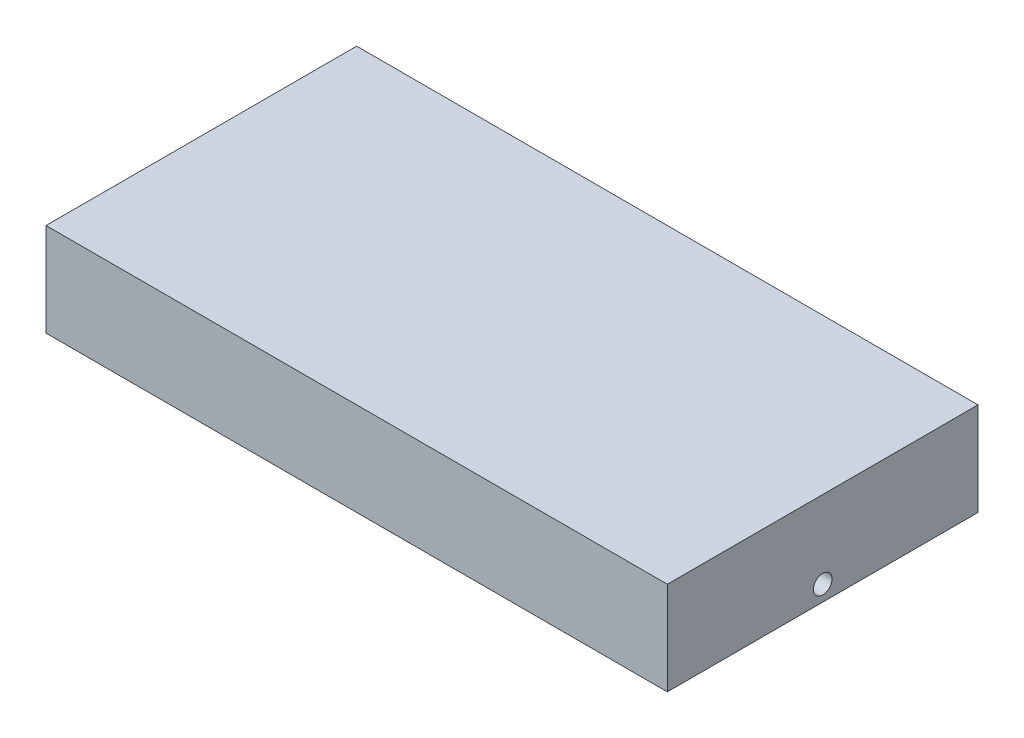
ISO-10303-21;
HEADER;
FILE_DESCRIPTION(('STEP AP214'),'2;1');
FILE_NAME('part.step','',(''),(''),'','','');
FILE_SCHEMA(('AUTOMOTIVE_DESIGN { 1 0 10303 214 1 1 1 1 }'));
ENDSEC;
DATA;
#1=APPLICATION_CONTEXT('core data for automotive mechanical design processes');
#2=APPLICATION_PROTOCOL_DEFINITION('international standard','automotive_design',2000,#1);
#3=PRODUCT_CONTEXT('',#1,'mechanical');
#4=PRODUCT('Part','Part','',(#3));
#5=PRODUCT_RELATED_PRODUCT_CATEGORY('part','',(#4));
#6=PRODUCT_DEFINITION_FORMATION('','',#4);
#7=PRODUCT_DEFINITION_CONTEXT('part definition',#1,'design');
#8=PRODUCT_DEFINITION('design','',#6,#7);
#9=PRODUCT_DEFINITION_SHAPE('','',#8);
#10=(LENGTH_UNIT() NAMED_UNIT(*) SI_UNIT(.MILLI.,.METRE.));
#11=(NAMED_UNIT(*) PLANE_ANGLE_UNIT() SI_UNIT($,.RADIAN.));
#12=(NAMED_UNIT(*) SI_UNIT($,.STERADIAN.) SOLID_ANGLE_UNIT());
#13=UNCERTAINTY_MEASURE_WITH_UNIT(LENGTH_MEASURE(1.E-05),#10,'distance_accuracy_value','');
#14=(GEOMETRIC_REPRESENTATION_CONTEXT(3) GLOBAL_UNCERTAINTY_ASSIGNED_CONTEXT((#13)) GLOBAL_UNIT_ASSIGNED_CONTEXT((#10,
#11,#12)) REPRESENTATION_CONTEXT('',''));
#15=CARTESIAN_POINT('',(0.,0.,0.));
#16=DIRECTION('',(0.,0.,1.));
#17=DIRECTION('',(1.,0.,0.));
#18=AXIS2_PLACEMENT_3D('',#15,#16,#17);
#19=CARTESIAN_POINT('',(-9.5,1.3,3.));
#20=DIRECTION('',(0.,-1.,0.));
#21=DIRECTION('',(0.,0.,-1.));
#22=AXIS2_PLACEMENT_3D('',#19,#20,#21);
#23=PLANE('',#22);
#24=DIRECTION('',(0.,0.,-1.));
#25=VECTOR('',#24,1.);
#26=CARTESIAN_POINT('',(-8.2,1.3,3.));
#27=LINE('',#26,#25);
#28=CARTESIAN_POINT('',(-8.2,1.3,3.));
#29=VERTEX_POINT('',#28);
#30=CARTESIAN_POINT('',(-8.2,1.3,-3.));
#31=VERTEX_POINT('',#30);
#32=EDGE_CURVE('E11',#29,#31,#27,.T.);
#33=ORIENTED_EDGE('',*,*,#32,.F.);
#34=DIRECTION('',(1.,0.,0.));
#35=VECTOR('',#34,1.);
#36=CARTESIAN_POINT('',(-9.5,1.3,3.));
#37=LINE('',#36,#35);
#38=CARTESIAN_POINT('',(-8.,1.3,3.));
#39=VERTEX_POINT('',#38);
#40=EDGE_CURVE('E234',#29,#39,#37,.T.);
#41=ORIENTED_EDGE('',*,*,#40,.T.);
#42=DIRECTION('',(0.,0.,-1.));
#43=VECTOR('',#42,1.);
#44=CARTESIAN_POINT('',(-8.,1.3,3.));
#45=LINE('',#44,#43);
#46=CARTESIAN_POINT('',(-8.,1.3,-3.));
#47=VERTEX_POINT('',#46);
#48=EDGE_CURVE('E224',#39,#47,#45,.T.);
#49=ORIENTED_EDGE('',*,*,#48,.T.);
#50=DIRECTION('',(1.,0.,0.));
#51=VECTOR('',#50,1.);
#52=CARTESIAN_POINT('',(-9.5,1.3,-3.));
#53=LINE('',#52,#51);
#54=EDGE_CURVE('E244',#31,#47,#53,.T.);
#55=ORIENTED_EDGE('',*,*,#54,.F.);
#56=EDGE_LOOP('',(#33,#41,#49,#55));
#57=FACE_BOUND('',#56,.T.);
#58=ADVANCED_FACE('F35',(#57),#23,.F.);
#59=CARTESIAN_POINT('',(-8.,2.,-3.));
#60=DIRECTION('',(1.,0.,0.));
#61=DIRECTION('',(0.,0.,-1.));
#62=AXIS2_PLACEMENT_3D('',#59,#60,#61);
#63=PLANE('',#62);
#64=DIRECTION('',(0.,0.,1.));
#65=VECTOR('',#64,1.);
#66=CARTESIAN_POINT('',(-8.,1.5,3.));
#67=LINE('',#66,#65);
#68=CARTESIAN_POINT('',(-8.,1.5,-3.));
#69=VERTEX_POINT('',#68);
#70=CARTESIAN_POINT('',(-8.,1.5,3.));
#71=VERTEX_POINT('',#70);
#72=EDGE_CURVE('E228',#69,#71,#67,.T.);
#73=ORIENTED_EDGE('',*,*,#72,.F.);
#74=DIRECTION('',(0.,-1.,0.));
#75=VECTOR('',#74,1.);
#76=CARTESIAN_POINT('',(-8.,2.,-3.));
#77=LINE('',#76,#75);
#78=CARTESIAN_POINT('',(-8.,2.,-3.));
#79=VERTEX_POINT('',#78);
#80=EDGE_CURVE('E268',#79,#69,#77,.T.);
#81=ORIENTED_EDGE('',*,*,#80,.F.);
#82=DIRECTION('',(0.,0.,1.));
#83=VECTOR('',#82,1.);
#84=CARTESIAN_POINT('',(-8.,2.,-3.));
#85=LINE('',#84,#83);
#86=CARTESIAN_POINT('',(-8.,2.,3.));
#87=VERTEX_POINT('',#86);
#88=EDGE_CURVE('E247',#79,#87,#85,.T.);
#89=ORIENTED_EDGE('',*,*,#88,.T.);
#90=DIRECTION('',(0.,-1.,0.));
#91=VECTOR('',#90,1.);
#92=CARTESIAN_POINT('',(-8.,2.,3.));
#93=LINE('',#92,#91);
#94=EDGE_CURVE('E276',#87,#71,#93,.T.);
#95=ORIENTED_EDGE('',*,*,#94,.T.);
#96=EDGE_LOOP('',(#73,#81,#89,#95));
#97=FACE_BOUND('',#96,.T.);
#98=ADVANCED_FACE('F339',(#97),#63,.T.);
#99=CARTESIAN_POINT('',(0.,0.,0.));
#100=DIRECTION('',(0.,1.,0.));
#101=DIRECTION('',(0.,0.,1.));
#102=AXIS2_PLACEMENT_3D('',#99,#100,#101);
#103=PLANE('',#102);
#104=DIRECTION('',(1.,0.,0.));
#105=VECTOR('',#104,1.);
#106=CARTESIAN_POINT('',(8.1,0.,-3.));
#107=LINE('',#106,#105);
#108=CARTESIAN_POINT('',(8.1,0.,-3.));
#109=VERTEX_POINT('',#108);
#110=CARTESIAN_POINT('',(9.5,0.,-3.));
#111=VERTEX_POINT('',#110);
#112=EDGE_CURVE('E194',#109,#111,#107,.T.);
#113=ORIENTED_EDGE('',*,*,#112,.F.);
#114=DIRECTION('',(0.,0.,-1.));
#115=VECTOR('',#114,1.);
#116=CARTESIAN_POINT('',(8.1,0.,3.));
#117=LINE('',#116,#115);
#118=CARTESIAN_POINT('',(8.1,0.,3.));
#119=VERTEX_POINT('',#118);
#120=EDGE_CURVE('E50',#119,#109,#117,.T.);
#121=ORIENTED_EDGE('',*,*,#120,.F.);
#122=DIRECTION('',(-1.,0.,0.));
#123=VECTOR('',#122,1.);
#124=CARTESIAN_POINT('',(8.1,0.,3.));
#125=LINE('',#124,#123);
#126=CARTESIAN_POINT('',(9.5,0.,3.));
#127=VERTEX_POINT('',#126);
#128=EDGE_CURVE('E182',#127,#119,#125,.T.);
#129=ORIENTED_EDGE('',*,*,#128,.F.);
#130=DIRECTION('',(0.,0.,1.));
#131=VECTOR('',#130,1.);
#132=CARTESIAN_POINT('',(9.5,0.,3.));
#133=LINE('',#132,#131);
#134=EDGE_CURVE('E185',#111,#127,#133,.T.);
#135=ORIENTED_EDGE('',*,*,#134,.F.);
#136=EDGE_LOOP('',(#113,#121,#129,#135));
#137=FACE_BOUND('',#136,.T.);
#138=DIRECTION('',(0.,0.,1.));
#139=VECTOR('',#138,1.);
#140=CARTESIAN_POINT('',(-9.99999999999999,0.,-5.));
#141=LINE('',#140,#139);
#142=CARTESIAN_POINT('',(-9.99999999999999,0.,-5.));
#143=VERTEX_POINT('',#142);
#144=CARTESIAN_POINT('',(-9.99999999999998,0.,5.));
#145=VERTEX_POINT('',#144);
#146=EDGE_CURVE('E279',#143,#145,#141,.T.);
#147=ORIENTED_EDGE('',*,*,#146,.F.);
#148=DIRECTION('',(-1.,0.,0.));
#149=VECTOR('',#148,1.);
#150=CARTESIAN_POINT('',(-9.99999999999999,0.,-5.));
#151=LINE('',#150,#149);
#152=CARTESIAN_POINT('',(9.99999999999999,0.,-5.));
#153=VERTEX_POINT('',#152);
#154=EDGE_CURVE('E284',#153,#143,#151,.T.);
#155=ORIENTED_EDGE('',*,*,#154,.F.);
#156=DIRECTION('',(0.,0.,-1.));
#157=VECTOR('',#156,1.);
#158=CARTESIAN_POINT('',(9.99999999999999,0.,-5.));
#159=LINE('',#158,#157);
#160=CARTESIAN_POINT('',(9.99999999999999,0.,5.));
#161=VERTEX_POINT('',#160);
#162=EDGE_CURVE('E295',#161,#153,#159,.T.);
#163=ORIENTED_EDGE('',*,*,#162,.F.);
#164=DIRECTION('',(1.,0.,0.));
#165=VECTOR('',#164,1.);
#166=CARTESIAN_POINT('',(-9.99999999999998,0.,5.));
#167=LINE('',#166,#165);
#168=EDGE_CURVE('E293',#145,#161,#167,.T.);
#169=ORIENTED_EDGE('',*,*,#168,.F.);
#170=EDGE_LOOP('',(#147,#155,#163,#169));
#171=FACE_BOUND('',#170,.T.);
#172=DIRECTION('',(0.,0.,1.));
#173=VECTOR('',#172,1.);
#174=CARTESIAN_POINT('',(-8.,0.,-3.));
#175=LINE('',#174,#173);
#176=CARTESIAN_POINT('',(-8.,0.,-3.));
#177=VERTEX_POINT('',#176);
#178=CARTESIAN_POINT('',(-8.,0.,3.));
#179=VERTEX_POINT('',#178);
#180=EDGE_CURVE('E241',#177,#179,#175,.T.);
#181=ORIENTED_EDGE('',*,*,#180,.T.);
#182=DIRECTION('',(1.,0.,0.));
#183=VECTOR('',#182,1.);
#184=CARTESIAN_POINT('',(-8.,0.,3.));
#185=LINE('',#184,#183);
#186=CARTESIAN_POINT('',(8.,0.,3.));
#187=VERTEX_POINT('',#186);
#188=EDGE_CURVE('E260',#179,#187,#185,.T.);
#189=ORIENTED_EDGE('',*,*,#188,.T.);
#190=DIRECTION('',(0.,0.,-1.));
#191=VECTOR('',#190,1.);
#192=CARTESIAN_POINT('',(8.,0.,-3.));
#193=LINE('',#192,#191);
#194=CARTESIAN_POINT('',(8.,0.,-3.));
#195=VERTEX_POINT('',#194);
#196=EDGE_CURVE('E263',#187,#195,#193,.T.);
#197=ORIENTED_EDGE('',*,*,#196,.T.);
#198=DIRECTION('',(-1.,0.,0.));
#199=VECTOR('',#198,1.);
#200=CARTESIAN_POINT('',(-8.,0.,-3.));
#201=LINE('',#200,#199);
#202=EDGE_CURVE('E251',#195,#177,#201,.T.);
#203=ORIENTED_EDGE('',*,*,#202,.T.);
#204=EDGE_LOOP('',(#181,#189,#197,#203));
#205=FACE_BOUND('',#204,.T.);
#206=ADVANCED_FACE('F316',(#137,#171,#205),#103,.F.);
#207=CARTESIAN_POINT('',(-9.99999999999999,3.,-5.));
#208=DIRECTION('',(1.,0.,0.));
#209=DIRECTION('',(0.,0.,-1.));
#210=AXIS2_PLACEMENT_3D('',#207,#208,#209);
#211=PLANE('',#210);
#212=CARTESIAN_POINT('',(-9.99999999999999,0.5,0.));
#213=DIRECTION('',(-1.,0.,0.));
#214=DIRECTION('',(0.,0.,1.));
#215=AXIS2_PLACEMENT_3D('',#212,#213,#214);
#216=CIRCLE('',#215,0.3);
#217=CARTESIAN_POINT('',(-9.99999999999999,0.5,0.300000000000014));
#218=VERTEX_POINT('',#217);
#219=EDGE_CURVE('E201',#218,#218,#216,.T.);
#220=ORIENTED_EDGE('',*,*,#219,.F.);
#221=EDGE_LOOP('',(#220));
#222=FACE_BOUND('',#221,.T.);
#223=ORIENTED_EDGE('',*,*,#146,.T.);
#224=DIRECTION('',(0.,-1.,0.));
#225=VECTOR('',#224,1.);
#226=CARTESIAN_POINT('',(-9.99999999999998,3.,5.));
#227=LINE('',#226,#225);
#228=CARTESIAN_POINT('',(-9.99999999999998,3.,5.));
#229=VERTEX_POINT('',#228);
#230=EDGE_CURVE('E43',#229,#145,#227,.T.);
#231=ORIENTED_EDGE('',*,*,#230,.F.);
#232=DIRECTION('',(0.,0.,1.));
#233=VECTOR('',#232,1.);
#234=CARTESIAN_POINT('',(-9.99999999999999,3.,-5.));
#235=LINE('',#234,#233);
#236=CARTESIAN_POINT('',(-9.99999999999999,3.,-5.));
#237=VERTEX_POINT('',#236);
#238=EDGE_CURVE('E280',#237,#229,#235,.T.);
#239=ORIENTED_EDGE('',*,*,#238,.F.);
#240=DIRECTION('',(0.,-1.,0.));
#241=VECTOR('',#240,1.);
#242=CARTESIAN_POINT('',(-9.99999999999999,3.,-5.));
#243=LINE('',#242,#241);
#244=EDGE_CURVE('E290',#237,#143,#243,.T.);
#245=ORIENTED_EDGE('',*,*,#244,.T.);
#246=EDGE_LOOP('',(#223,#231,#239,#245));
#247=FACE_BOUND('',#246,.T.);
#248=ADVANCED_FACE('F37',(#222,#247),#211,.F.);
#249=CARTESIAN_POINT('',(-9.99999999999998,3.,5.));
#250=DIRECTION('',(0.,0.,-1.));
#251=DIRECTION('',(-1.,0.,0.));
#252=AXIS2_PLACEMENT_3D('',#249,#250,#251);
#253=PLANE('',#252);
#254=ORIENTED_EDGE('',*,*,#168,.T.);
#255=DIRECTION('',(0.,-1.,0.));
#256=VECTOR('',#255,1.);
#257=CARTESIAN_POINT('',(9.99999999999999,3.,5.));
#258=LINE('',#257,#256);
#259=CARTESIAN_POINT('',(9.99999999999999,3.,5.));
#260=VERTEX_POINT('',#259);
#261=EDGE_CURVE('E303',#260,#161,#258,.T.);
#262=ORIENTED_EDGE('',*,*,#261,.F.);
#263=DIRECTION('',(1.,0.,0.));
#264=VECTOR('',#263,1.);
#265=CARTESIAN_POINT('',(-9.99999999999998,3.,5.));
#266=LINE('',#265,#264);
#267=EDGE_CURVE('E283',#229,#260,#266,.T.);
#268=ORIENTED_EDGE('',*,*,#267,.F.);
#269=ORIENTED_EDGE('',*,*,#230,.T.);
#270=EDGE_LOOP('',(#254,#262,#268,#269));
#271=FACE_BOUND('',#270,.T.);
#272=ADVANCED_FACE('F308',(#271),#253,.F.);
#273=CARTESIAN_POINT('',(9.99999999999999,3.,-5.));
#274=DIRECTION('',(-1.,0.,0.));
#275=DIRECTION('',(0.,0.,1.));
#276=AXIS2_PLACEMENT_3D('',#273,#274,#275);
#277=PLANE('',#276);
#278=CARTESIAN_POINT('',(9.99999999999999,0.5,0.));
#279=DIRECTION('',(1.,0.,0.));
#280=DIRECTION('',(0.,0.,-1.));
#281=AXIS2_PLACEMENT_3D('',#278,#279,#280);
#282=CIRCLE('',#281,0.3);
#283=CARTESIAN_POINT('',(9.99999999999999,0.5,-0.299999999999986));
#284=VERTEX_POINT('',#283);
#285=EDGE_CURVE('E188',#284,#284,#282,.T.);
#286=ORIENTED_EDGE('',*,*,#285,.F.);
#287=EDGE_LOOP('',(#286));
#288=FACE_BOUND('',#287,.T.);
#289=ORIENTED_EDGE('',*,*,#162,.T.);
#290=DIRECTION('',(0.,-1.,0.));
#291=VECTOR('',#290,1.);
#292=CARTESIAN_POINT('',(9.99999999999999,3.,-5.));
#293=LINE('',#292,#291);
#294=CARTESIAN_POINT('',(9.99999999999999,3.,-5.));
#295=VERTEX_POINT('',#294);
#296=EDGE_CURVE('E300',#295,#153,#293,.T.);
#297=ORIENTED_EDGE('',*,*,#296,.F.);
#298=DIRECTION('',(0.,0.,-1.));
#299=VECTOR('',#298,1.);
#300=CARTESIAN_POINT('',(9.99999999999999,3.,-5.));
#301=LINE('',#300,#299);
#302=EDGE_CURVE('E286',#260,#295,#301,.T.);
#303=ORIENTED_EDGE('',*,*,#302,.F.);
#304=ORIENTED_EDGE('',*,*,#261,.T.);
#305=EDGE_LOOP('',(#289,#297,#303,#304));
#306=FACE_BOUND('',#305,.T.);
#307=ADVANCED_FACE('F321',(#288,#306),#277,.F.);
#308=CARTESIAN_POINT('',(-9.99999999999999,3.,-5.));
#309=DIRECTION('',(0.,0.,1.));
#310=DIRECTION('',(1.,0.,0.));
#311=AXIS2_PLACEMENT_3D('',#308,#309,#310);
#312=PLANE('',#311);
#313=ORIENTED_EDGE('',*,*,#154,.T.);
#314=ORIENTED_EDGE('',*,*,#244,.F.);
#315=DIRECTION('',(-1.,0.,0.));
#316=VECTOR('',#315,1.);
#317=CARTESIAN_POINT('',(-9.99999999999999,3.,-5.));
#318=LINE('',#317,#316);
#319=EDGE_CURVE('E288',#295,#237,#318,.T.);
#320=ORIENTED_EDGE('',*,*,#319,.F.);
#321=ORIENTED_EDGE('',*,*,#296,.T.);
#322=EDGE_LOOP('',(#313,#314,#320,#321));
#323=FACE_BOUND('',#322,.T.);
#324=ADVANCED_FACE('F325',(#323),#312,.F.);
#325=CARTESIAN_POINT('',(0.,3.,0.));
#326=DIRECTION('',(0.,1.,0.));
#327=DIRECTION('',(0.,0.,1.));
#328=AXIS2_PLACEMENT_3D('',#325,#326,#327);
#329=PLANE('',#328);
#330=ORIENTED_EDGE('',*,*,#238,.T.);
#331=ORIENTED_EDGE('',*,*,#267,.T.);
#332=ORIENTED_EDGE('',*,*,#302,.T.);
#333=ORIENTED_EDGE('',*,*,#319,.T.);
#334=EDGE_LOOP('',(#330,#331,#332,#333));
#335=FACE_BOUND('',#334,.T.);
#336=ADVANCED_FACE('F327',(#335),#329,.T.);
#337=ORIENTED_EDGE('',*,*,#48,.F.);
#338=EDGE_CURVE('E275',#39,#179,#93,.T.);
#339=ORIENTED_EDGE('',*,*,#338,.T.);
#340=ORIENTED_EDGE('',*,*,#180,.F.);
#341=EDGE_CURVE('E257',#47,#177,#77,.T.);
#342=ORIENTED_EDGE('',*,*,#341,.F.);
#343=EDGE_LOOP('',(#337,#339,#340,#342));
#344=FACE_BOUND('',#343,.T.);
#345=ADVANCED_FACE('F329',(#344),#63,.T.);
#346=CARTESIAN_POINT('',(-8.,2.,3.));
#347=DIRECTION('',(0.,0.,-1.));
#348=DIRECTION('',(-1.,0.,0.));
#349=AXIS2_PLACEMENT_3D('',#346,#347,#348);
#350=PLANE('',#349);
#351=DIRECTION('',(1.,0.,0.));
#352=VECTOR('',#351,1.);
#353=CARTESIAN_POINT('',(-9.5,1.5,3.));
#354=LINE('',#353,#352);
#355=CARTESIAN_POINT('',(-9.5,1.5,3.));
#356=VERTEX_POINT('',#355);
#357=EDGE_CURVE('E239',#356,#71,#354,.T.);
#358=ORIENTED_EDGE('',*,*,#357,.T.);
#359=ORIENTED_EDGE('',*,*,#94,.F.);
#360=DIRECTION('',(1.,0.,0.));
#361=VECTOR('',#360,1.);
#362=CARTESIAN_POINT('',(-8.,2.,3.));
#363=LINE('',#362,#361);
#364=CARTESIAN_POINT('',(8.,2.,3.));
#365=VERTEX_POINT('',#364);
#366=EDGE_CURVE('E250',#87,#365,#363,.T.);
#367=ORIENTED_EDGE('',*,*,#366,.T.);
#368=DIRECTION('',(0.,-1.,0.));
#369=VECTOR('',#368,1.);
#370=CARTESIAN_POINT('',(8.,2.,3.));
#371=LINE('',#370,#369);
#372=EDGE_CURVE('E273',#365,#187,#371,.T.);
#373=ORIENTED_EDGE('',*,*,#372,.T.);
#374=ORIENTED_EDGE('',*,*,#188,.F.);
#375=ORIENTED_EDGE('',*,*,#338,.F.);
#376=ORIENTED_EDGE('',*,*,#40,.F.);
#377=DIRECTION('',(0.,1.,0.));
#378=VECTOR('',#377,1.);
#379=CARTESIAN_POINT('',(-8.2,0.2,3.));
#380=LINE('',#379,#378);
#381=CARTESIAN_POINT('',(-8.2,0.2,3.));
#382=VERTEX_POINT('',#381);
#383=EDGE_CURVE('E222',#382,#29,#380,.T.);
#384=ORIENTED_EDGE('',*,*,#383,.F.);
#385=DIRECTION('',(-1.,0.,0.));
#386=VECTOR('',#385,1.);
#387=CARTESIAN_POINT('',(-8.2,0.2,3.));
#388=LINE('',#387,#386);
#389=CARTESIAN_POINT('',(-9.5,0.2,3.));
#390=VERTEX_POINT('',#389);
#391=EDGE_CURVE('E211',#382,#390,#388,.T.);
#392=ORIENTED_EDGE('',*,*,#391,.T.);
#393=DIRECTION('',(0.,-1.,0.));
#394=VECTOR('',#393,1.);
#395=CARTESIAN_POINT('',(-9.5,1.3,3.));
#396=LINE('',#395,#394);
#397=EDGE_CURVE('E225',#356,#390,#396,.T.);
#398=ORIENTED_EDGE('',*,*,#397,.F.);
#399=EDGE_LOOP('',(#358,#359,#367,#373,#374,#375,#376,#384,#392,#398));
#400=FACE_BOUND('',#399,.T.);
#401=ADVANCED_FACE('F336',(#400),#350,.T.);
#402=CARTESIAN_POINT('',(8.,2.,-3.));
#403=DIRECTION('',(-1.,0.,0.));
#404=DIRECTION('',(0.,0.,1.));
#405=AXIS2_PLACEMENT_3D('',#402,#403,#404);
#406=PLANE('',#405);
#407=ORIENTED_EDGE('',*,*,#196,.F.);
#408=ORIENTED_EDGE('',*,*,#372,.F.);
#409=DIRECTION('',(0.,0.,-1.));
#410=VECTOR('',#409,1.);
#411=CARTESIAN_POINT('',(8.,2.,-3.));
#412=LINE('',#411,#410);
#413=CARTESIAN_POINT('',(8.,2.,-3.));
#414=VERTEX_POINT('',#413);
#415=EDGE_CURVE('E253',#365,#414,#412,.T.);
#416=ORIENTED_EDGE('',*,*,#415,.T.);
#417=DIRECTION('',(0.,-1.,0.));
#418=VECTOR('',#417,1.);
#419=CARTESIAN_POINT('',(8.,2.,-3.));
#420=LINE('',#419,#418);
#421=EDGE_CURVE('E271',#414,#195,#420,.T.);
#422=ORIENTED_EDGE('',*,*,#421,.T.);
#423=EDGE_LOOP('',(#407,#408,#416,#422));
#424=FACE_BOUND('',#423,.T.);
#425=ADVANCED_FACE('F363',(#424),#406,.T.);
#426=CARTESIAN_POINT('',(-8.,2.,-3.));
#427=DIRECTION('',(0.,0.,1.));
#428=DIRECTION('',(1.,0.,0.));
#429=AXIS2_PLACEMENT_3D('',#426,#427,#428);
#430=PLANE('',#429);
#431=DIRECTION('',(0.,1.,0.));
#432=VECTOR('',#431,1.);
#433=CARTESIAN_POINT('',(-8.2,0.2,-3.));
#434=LINE('',#433,#432);
#435=CARTESIAN_POINT('',(-8.2,0.2,-3.));
#436=VERTEX_POINT('',#435);
#437=EDGE_CURVE('E220',#436,#31,#434,.T.);
#438=ORIENTED_EDGE('',*,*,#437,.T.);
#439=ORIENTED_EDGE('',*,*,#54,.T.);
#440=ORIENTED_EDGE('',*,*,#341,.T.);
#441=ORIENTED_EDGE('',*,*,#202,.F.);
#442=ORIENTED_EDGE('',*,*,#421,.F.);
#443=DIRECTION('',(-1.,0.,0.));
#444=VECTOR('',#443,1.);
#445=CARTESIAN_POINT('',(-8.,2.,-3.));
#446=LINE('',#445,#444);
#447=EDGE_CURVE('E255',#414,#79,#446,.T.);
#448=ORIENTED_EDGE('',*,*,#447,.T.);
#449=ORIENTED_EDGE('',*,*,#80,.T.);
#450=DIRECTION('',(1.,0.,0.));
#451=VECTOR('',#450,1.);
#452=CARTESIAN_POINT('',(-9.5,1.5,-3.));
#453=LINE('',#452,#451);
#454=CARTESIAN_POINT('',(-9.5,1.5,-3.));
#455=VERTEX_POINT('',#454);
#456=EDGE_CURVE('E242',#455,#69,#453,.T.);
#457=ORIENTED_EDGE('',*,*,#456,.F.);
#458=DIRECTION('',(0.,1.,0.));
#459=VECTOR('',#458,1.);
#460=CARTESIAN_POINT('',(-9.5,1.3,-3.));
#461=LINE('',#460,#459);
#462=CARTESIAN_POINT('',(-9.5,0.2,-3.));
#463=VERTEX_POINT('',#462);
#464=EDGE_CURVE('E227',#463,#455,#461,.T.);
#465=ORIENTED_EDGE('',*,*,#464,.F.);
#466=DIRECTION('',(1.,0.,0.));
#467=VECTOR('',#466,1.);
#468=CARTESIAN_POINT('',(-8.2,0.2,-3.));
#469=LINE('',#468,#467);
#470=EDGE_CURVE('E218',#463,#436,#469,.T.);
#471=ORIENTED_EDGE('',*,*,#470,.T.);
#472=EDGE_LOOP('',(#438,#439,#440,#441,#442,#448,#449,#457,#465,#471));
#473=FACE_BOUND('',#472,.T.);
#474=ADVANCED_FACE('F359',(#473),#430,.T.);
#475=CARTESIAN_POINT('',(0.,2.,0.));
#476=DIRECTION('',(0.,1.,0.));
#477=DIRECTION('',(0.,0.,1.));
#478=AXIS2_PLACEMENT_3D('',#475,#476,#477);
#479=PLANE('',#478);
#480=ORIENTED_EDGE('',*,*,#88,.F.);
#481=ORIENTED_EDGE('',*,*,#447,.F.);
#482=ORIENTED_EDGE('',*,*,#415,.F.);
#483=ORIENTED_EDGE('',*,*,#366,.F.);
#484=EDGE_LOOP('',(#480,#481,#482,#483));
#485=FACE_BOUND('',#484,.T.);
#486=ADVANCED_FACE('F356',(#485),#479,.F.);
#487=CARTESIAN_POINT('',(-9.5,1.5,3.));
#488=DIRECTION('',(0.,1.,0.));
#489=DIRECTION('',(0.,0.,1.));
#490=AXIS2_PLACEMENT_3D('',#487,#488,#489);
#491=PLANE('',#490);
#492=ORIENTED_EDGE('',*,*,#456,.T.);
#493=ORIENTED_EDGE('',*,*,#72,.T.);
#494=ORIENTED_EDGE('',*,*,#357,.F.);
#495=DIRECTION('',(0.,0.,1.));
#496=VECTOR('',#495,1.);
#497=CARTESIAN_POINT('',(-9.5,1.5,3.));
#498=LINE('',#497,#496);
#499=EDGE_CURVE('E231',#455,#356,#498,.T.);
#500=ORIENTED_EDGE('',*,*,#499,.F.);
#501=EDGE_LOOP('',(#492,#493,#494,#500));
#502=FACE_BOUND('',#501,.T.);
#503=ADVANCED_FACE('F354',(#502),#491,.F.);
#504=CARTESIAN_POINT('',(-9.5,0.,0.));
#505=DIRECTION('',(-1.,0.,0.));
#506=DIRECTION('',(0.,0.,1.));
#507=AXIS2_PLACEMENT_3D('',#504,#505,#506);
#508=PLANE('',#507);
#509=DIRECTION('',(0.,0.,-1.));
#510=VECTOR('',#509,1.);
#511=CARTESIAN_POINT('',(-9.5,0.2,3.));
#512=LINE('',#511,#510);
#513=CARTESIAN_POINT('',(-9.49999999999999,0.2,0.));
#514=VERTEX_POINT('',#513);
#515=EDGE_CURVE('E215',#390,#514,#512,.T.);
#516=ORIENTED_EDGE('',*,*,#515,.T.);
#517=CARTESIAN_POINT('',(-9.49999999999999,0.5,0.));
#518=DIRECTION('',(-1.,0.,0.));
#519=DIRECTION('',(0.,0.,1.));
#520=AXIS2_PLACEMENT_3D('',#517,#518,#519);
#521=CIRCLE('',#520,0.3);
#522=EDGE_CURVE('E56',#514,#514,#521,.T.);
#523=ORIENTED_EDGE('',*,*,#522,.T.);
#524=EDGE_CURVE('E214',#514,#463,#512,.T.);
#525=ORIENTED_EDGE('',*,*,#524,.T.);
#526=ORIENTED_EDGE('',*,*,#464,.T.);
#527=ORIENTED_EDGE('',*,*,#499,.T.);
#528=ORIENTED_EDGE('',*,*,#397,.T.);
#529=EDGE_LOOP('',(#516,#523,#525,#526,#527,#528));
#530=FACE_BOUND('',#529,.T.);
#531=ADVANCED_FACE('F402',(#530),#508,.F.);
#532=CARTESIAN_POINT('',(-8.2,0.2,3.));
#533=DIRECTION('',(-1.,0.,0.));
#534=DIRECTION('',(0.,0.,1.));
#535=AXIS2_PLACEMENT_3D('',#532,#533,#534);
#536=PLANE('',#535);
#537=ORIENTED_EDGE('',*,*,#32,.T.);
#538=ORIENTED_EDGE('',*,*,#437,.F.);
#539=DIRECTION('',(0.,0.,1.));
#540=VECTOR('',#539,1.);
#541=CARTESIAN_POINT('',(-8.2,0.2,3.));
#542=LINE('',#541,#540);
#543=EDGE_CURVE('E206',#436,#382,#542,.T.);
#544=ORIENTED_EDGE('',*,*,#543,.T.);
#545=ORIENTED_EDGE('',*,*,#383,.T.);
#546=EDGE_LOOP('',(#537,#538,#544,#545));
#547=FACE_BOUND('',#546,.T.);
#548=ADVANCED_FACE('F394',(#547),#536,.T.);
#549=CARTESIAN_POINT('',(0.,0.2,0.));
#550=DIRECTION('',(0.,1.,0.));
#551=DIRECTION('',(0.,0.,1.));
#552=AXIS2_PLACEMENT_3D('',#549,#550,#551);
#553=PLANE('',#552);
#554=ORIENTED_EDGE('',*,*,#543,.F.);
#555=ORIENTED_EDGE('',*,*,#470,.F.);
#556=ORIENTED_EDGE('',*,*,#524,.F.);
#557=ORIENTED_EDGE('',*,*,#515,.F.);
#558=ORIENTED_EDGE('',*,*,#391,.F.);
#559=EDGE_LOOP('',(#554,#555,#556,#557,#558));
#560=FACE_BOUND('',#559,.T.);
#561=ADVANCED_FACE('F399',(#560),#553,.T.);
#562=CARTESIAN_POINT('',(-9.49999999999999,0.5,0.));
#563=DIRECTION('',(-1.,0.,0.));
#564=DIRECTION('',(0.,0.,1.));
#565=AXIS2_PLACEMENT_3D('',#562,#563,#564);
#566=CYLINDRICAL_SURFACE('',#565,0.3);
#567=ORIENTED_EDGE('',*,*,#522,.F.);
#568=EDGE_LOOP('',(#567));
#569=FACE_BOUND('',#568,.T.);
#570=ORIENTED_EDGE('',*,*,#219,.T.);
#571=EDGE_LOOP('',(#570));
#572=FACE_BOUND('',#571,.T.);
#573=ADVANCED_FACE('F413',(#569,#572),#566,.F.);
#574=CARTESIAN_POINT('',(8.1,1.5,3.));
#575=DIRECTION('',(-1.,0.,0.));
#576=DIRECTION('',(0.,0.,1.));
#577=AXIS2_PLACEMENT_3D('',#574,#575,#576);
#578=PLANE('',#577);
#579=ORIENTED_EDGE('',*,*,#120,.T.);
#580=DIRECTION('',(0.,-1.,0.));
#581=VECTOR('',#580,1.);
#582=CARTESIAN_POINT('',(8.1,1.5,-3.));
#583=LINE('',#582,#581);
#584=CARTESIAN_POINT('',(8.1,1.5,-3.));
#585=VERTEX_POINT('',#584);
#586=EDGE_CURVE('E160',#585,#109,#583,.T.);
#587=ORIENTED_EDGE('',*,*,#586,.F.);
#588=DIRECTION('',(0.,0.,-1.));
#589=VECTOR('',#588,1.);
#590=CARTESIAN_POINT('',(8.1,1.5,3.));
#591=LINE('',#590,#589);
#592=CARTESIAN_POINT('',(8.1,1.5,3.));
#593=VERTEX_POINT('',#592);
#594=EDGE_CURVE('E164',#593,#585,#591,.T.);
#595=ORIENTED_EDGE('',*,*,#594,.F.);
#596=DIRECTION('',(0.,-1.,0.));
#597=VECTOR('',#596,1.);
#598=CARTESIAN_POINT('',(8.1,1.5,3.));
#599=LINE('',#598,#597);
#600=EDGE_CURVE('E199',#593,#119,#599,.T.);
#601=ORIENTED_EDGE('',*,*,#600,.T.);
#602=EDGE_LOOP('',(#579,#587,#595,#601));
#603=FACE_BOUND('',#602,.T.);
#604=ADVANCED_FACE('F162',(#603),#578,.F.);
#605=CARTESIAN_POINT('',(8.1,1.5,3.));
#606=DIRECTION('',(0.,0.,1.));
#607=DIRECTION('',(1.,0.,0.));
#608=AXIS2_PLACEMENT_3D('',#605,#606,#607);
#609=PLANE('',#608);
#610=ORIENTED_EDGE('',*,*,#128,.T.);
#611=ORIENTED_EDGE('',*,*,#600,.F.);
#612=DIRECTION('',(-1.,0.,0.));
#613=VECTOR('',#612,1.);
#614=CARTESIAN_POINT('',(8.1,1.5,3.));
#615=LINE('',#614,#613);
#616=CARTESIAN_POINT('',(9.5,1.5,3.));
#617=VERTEX_POINT('',#616);
#618=EDGE_CURVE('E170',#617,#593,#615,.T.);
#619=ORIENTED_EDGE('',*,*,#618,.F.);
#620=DIRECTION('',(0.,-1.,0.));
#621=VECTOR('',#620,1.);
#622=CARTESIAN_POINT('',(9.5,1.5,3.));
#623=LINE('',#622,#621);
#624=EDGE_CURVE('E202',#617,#127,#623,.T.);
#625=ORIENTED_EDGE('',*,*,#624,.T.);
#626=EDGE_LOOP('',(#610,#611,#619,#625));
#627=FACE_BOUND('',#626,.T.);
#628=ADVANCED_FACE('F418',(#627),#609,.F.);
#629=CARTESIAN_POINT('',(9.5,1.5,3.));
#630=DIRECTION('',(1.,0.,0.));
#631=DIRECTION('',(0.,0.,-1.));
#632=AXIS2_PLACEMENT_3D('',#629,#630,#631);
#633=PLANE('',#632);
#634=CARTESIAN_POINT('',(9.49999999999999,0.5,0.));
#635=DIRECTION('',(1.,0.,0.));
#636=DIRECTION('',(0.,0.,-1.));
#637=AXIS2_PLACEMENT_3D('',#634,#635,#636);
#638=CIRCLE('',#637,0.3);
#639=CARTESIAN_POINT('',(9.49999999999999,0.5,-0.299999999999986));
#640=VERTEX_POINT('',#639);
#641=EDGE_CURVE('E195',#640,#640,#638,.T.);
#642=ORIENTED_EDGE('',*,*,#641,.T.);
#643=EDGE_LOOP('',(#642));
#644=FACE_BOUND('',#643,.T.);
#645=ORIENTED_EDGE('',*,*,#134,.T.);
#646=ORIENTED_EDGE('',*,*,#624,.F.);
#647=DIRECTION('',(0.,0.,1.));
#648=VECTOR('',#647,1.);
#649=CARTESIAN_POINT('',(9.5,1.5,3.));
#650=LINE('',#649,#648);
#651=CARTESIAN_POINT('',(9.5,1.5,-3.));
#652=VERTEX_POINT('',#651);
#653=EDGE_CURVE('E178',#652,#617,#650,.T.);
#654=ORIENTED_EDGE('',*,*,#653,.F.);
#655=DIRECTION('',(0.,-1.,0.));
#656=VECTOR('',#655,1.);
#657=CARTESIAN_POINT('',(9.5,1.5,-3.));
#658=LINE('',#657,#656);
#659=EDGE_CURVE('E169',#652,#111,#658,.T.);
#660=ORIENTED_EDGE('',*,*,#659,.T.);
#661=EDGE_LOOP('',(#645,#646,#654,#660));
#662=FACE_BOUND('',#661,.T.);
#663=ADVANCED_FACE('F421',(#644,#662),#633,.F.);
#664=CARTESIAN_POINT('',(8.1,1.5,-3.));
#665=DIRECTION('',(0.,0.,-1.));
#666=DIRECTION('',(-1.,0.,0.));
#667=AXIS2_PLACEMENT_3D('',#664,#665,#666);
#668=PLANE('',#667);
#669=ORIENTED_EDGE('',*,*,#112,.T.);
#670=ORIENTED_EDGE('',*,*,#659,.F.);
#671=DIRECTION('',(1.,0.,0.));
#672=VECTOR('',#671,1.);
#673=CARTESIAN_POINT('',(8.1,1.5,-3.));
#674=LINE('',#673,#672);
#675=EDGE_CURVE('E173',#585,#652,#674,.T.);
#676=ORIENTED_EDGE('',*,*,#675,.F.);
#677=ORIENTED_EDGE('',*,*,#586,.T.);
#678=EDGE_LOOP('',(#669,#670,#676,#677));
#679=FACE_BOUND('',#678,.T.);
#680=ADVANCED_FACE('F174',(#679),#668,.F.);
#681=CARTESIAN_POINT('',(0.,1.5,0.));
#682=DIRECTION('',(0.,-1.,0.));
#683=DIRECTION('',(0.,0.,-1.));
#684=AXIS2_PLACEMENT_3D('',#681,#682,#683);
#685=PLANE('',#684);
#686=ORIENTED_EDGE('',*,*,#594,.T.);
#687=ORIENTED_EDGE('',*,*,#675,.T.);
#688=ORIENTED_EDGE('',*,*,#653,.T.);
#689=ORIENTED_EDGE('',*,*,#618,.T.);
#690=EDGE_LOOP('',(#686,#687,#688,#689));
#691=FACE_BOUND('',#690,.T.);
#692=ADVANCED_FACE('F180',(#691),#685,.T.);
#693=CARTESIAN_POINT('',(9.49999999999999,0.5,0.));
#694=DIRECTION('',(1.,0.,0.));
#695=DIRECTION('',(0.,0.,-1.));
#696=AXIS2_PLACEMENT_3D('',#693,#694,#695);
#697=CYLINDRICAL_SURFACE('',#696,0.3);
#698=ORIENTED_EDGE('',*,*,#641,.F.);
#699=EDGE_LOOP('',(#698));
#700=FACE_BOUND('',#699,.T.);
#701=ORIENTED_EDGE('',*,*,#285,.T.);
#702=EDGE_LOOP('',(#701));
#703=FACE_BOUND('',#702,.T.);
#704=ADVANCED_FACE('F430',(#700,#703),#697,.F.);
#705=CLOSED_SHELL('',(#58,#98,#206,#248,#272,#307,#324,#336,#345,#401,#425,#474,#486,#503,#531,
#548,#561,#573,#604,#628,#663,#680,#692,#704));
#706=MANIFOLD_SOLID_BREP('B2',#705);
#707=ADVANCED_BREP_SHAPE_REPRESENTATION('',(#18,#706),#14);
#708=SHAPE_DEFINITION_REPRESENTATION(#9,#707);
ENDSEC;
END-ISO-10303-21;
